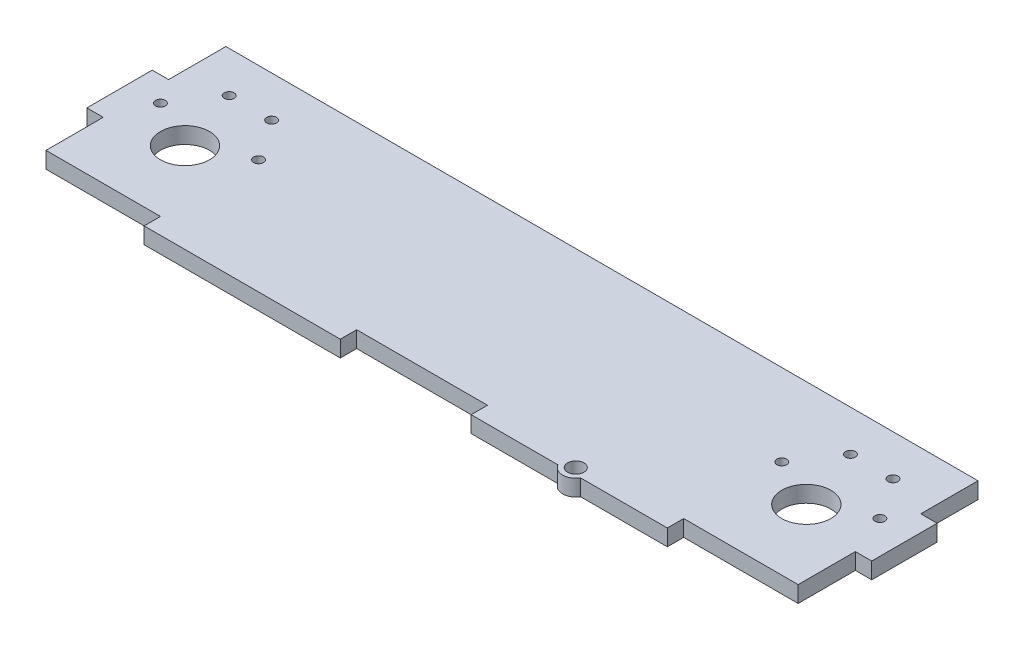
ISO-10303-21;
HEADER;
FILE_DESCRIPTION(('STEP AP214'),'2;1');
FILE_NAME('part.step','',(''),(''),'','','');
FILE_SCHEMA(('AUTOMOTIVE_DESIGN { 1 0 10303 214 1 1 1 1 }'));
ENDSEC;
DATA;
#1=APPLICATION_CONTEXT('core data for automotive mechanical design processes');
#2=APPLICATION_PROTOCOL_DEFINITION('international standard','automotive_design',2000,#1);
#3=PRODUCT_CONTEXT('',#1,'mechanical');
#4=PRODUCT('Part','Part','',(#3));
#5=PRODUCT_RELATED_PRODUCT_CATEGORY('part','',(#4));
#6=PRODUCT_DEFINITION_FORMATION('','',#4);
#7=PRODUCT_DEFINITION_CONTEXT('part definition',#1,'design');
#8=PRODUCT_DEFINITION('design','',#6,#7);
#9=PRODUCT_DEFINITION_SHAPE('','',#8);
#10=(LENGTH_UNIT() NAMED_UNIT(*) SI_UNIT(.MILLI.,.METRE.));
#11=(NAMED_UNIT(*) PLANE_ANGLE_UNIT() SI_UNIT($,.RADIAN.));
#12=(NAMED_UNIT(*) SI_UNIT($,.STERADIAN.) SOLID_ANGLE_UNIT());
#13=UNCERTAINTY_MEASURE_WITH_UNIT(LENGTH_MEASURE(1.E-05),#10,'distance_accuracy_value','');
#14=(GEOMETRIC_REPRESENTATION_CONTEXT(3) GLOBAL_UNCERTAINTY_ASSIGNED_CONTEXT((#13)) GLOBAL_UNIT_ASSIGNED_CONTEXT((#10,
#11,#12)) REPRESENTATION_CONTEXT('',''));
#15=CARTESIAN_POINT('',(0.,0.,0.));
#16=DIRECTION('',(0.,0.,1.));
#17=DIRECTION('',(1.,0.,0.));
#18=AXIS2_PLACEMENT_3D('',#15,#16,#17);
#19=CARTESIAN_POINT('',(54.7855342967924,5.,29.3914419247114));
#20=DIRECTION('',(0.,-1.,0.));
#21=DIRECTION('',(0.,0.,-1.));
#22=AXIS2_PLACEMENT_3D('',#19,#20,#21);
#23=CYLINDRICAL_SURFACE('',#22,4.00000000000001);
#24=CARTESIAN_POINT('',(54.7855342967924,0.,29.3914419247114));
#25=DIRECTION('',(0.,1.,0.));
#26=DIRECTION('',(0.,0.,1.));
#27=AXIS2_PLACEMENT_3D('',#24,#25,#26);
#28=CIRCLE('',#27,4.00000000000001);
#29=CARTESIAN_POINT('',(51.3214326816546,0.,31.3914419247114));
#30=VERTEX_POINT('',#29);
#31=CARTESIAN_POINT('',(58.2496359119302,0.,31.3914419247114));
#32=VERTEX_POINT('',#31);
#33=EDGE_CURVE('E252',#30,#32,#28,.T.);
#34=ORIENTED_EDGE('',*,*,#33,.T.);
#35=DIRECTION('',(0.,-1.,0.));
#36=VECTOR('',#35,1.);
#37=CARTESIAN_POINT('',(58.2496359119302,5.,31.3914419247114));
#38=LINE('',#37,#36);
#39=CARTESIAN_POINT('',(58.2496359119302,5.,31.3914419247114));
#40=VERTEX_POINT('',#39);
#41=EDGE_CURVE('E11',#40,#32,#38,.T.);
#42=ORIENTED_EDGE('',*,*,#41,.F.);
#43=CARTESIAN_POINT('',(54.7855342967924,5.,29.3914419247114));
#44=DIRECTION('',(0.,1.,0.));
#45=DIRECTION('',(0.,0.,1.));
#46=AXIS2_PLACEMENT_3D('',#43,#44,#45);
#47=CIRCLE('',#46,4.00000000000001);
#48=CARTESIAN_POINT('',(51.3214326816546,5.,31.3914419247114));
#49=VERTEX_POINT('',#48);
#50=EDGE_CURVE('E337',#49,#40,#47,.T.);
#51=ORIENTED_EDGE('',*,*,#50,.F.);
#52=DIRECTION('',(0.,-1.,0.));
#53=VECTOR('',#52,1.);
#54=CARTESIAN_POINT('',(51.3214326816546,5.,31.3914419247114));
#55=LINE('',#54,#53);
#56=EDGE_CURVE('E251',#49,#30,#55,.T.);
#57=ORIENTED_EDGE('',*,*,#56,.T.);
#58=EDGE_LOOP('',(#34,#42,#51,#57));
#59=FACE_BOUND('',#58,.T.);
#60=ADVANCED_FACE('F38',(#59),#23,.T.);
#61=CARTESIAN_POINT('',(0.,5.,31.3914419247114));
#62=DIRECTION('',(0.,0.,-1.));
#63=DIRECTION('',(-1.,0.,0.));
#64=AXIS2_PLACEMENT_3D('',#61,#62,#63);
#65=PLANE('',#64);
#66=DIRECTION('',(1.,0.,0.));
#67=VECTOR('',#66,1.);
#68=CARTESIAN_POINT('',(0.,0.,31.3914419247114));
#69=LINE('',#68,#67);
#70=CARTESIAN_POINT('',(84.7855342967924,0.,31.3914419247114));
#71=VERTEX_POINT('',#70);
#72=EDGE_CURVE('E255',#32,#71,#69,.T.);
#73=ORIENTED_EDGE('',*,*,#72,.T.);
#74=DIRECTION('',(0.,-1.,0.));
#75=VECTOR('',#74,1.);
#76=CARTESIAN_POINT('',(84.7855342967924,5.,31.3914419247114));
#77=LINE('',#76,#75);
#78=CARTESIAN_POINT('',(84.7855342967924,5.,31.3914419247114));
#79=VERTEX_POINT('',#78);
#80=EDGE_CURVE('E46',#79,#71,#77,.T.);
#81=ORIENTED_EDGE('',*,*,#80,.F.);
#82=DIRECTION('',(1.,0.,0.));
#83=VECTOR('',#82,1.);
#84=CARTESIAN_POINT('',(0.,5.,31.3914419247114));
#85=LINE('',#84,#83);
#86=EDGE_CURVE('E139',#40,#79,#85,.T.);
#87=ORIENTED_EDGE('',*,*,#86,.F.);
#88=ORIENTED_EDGE('',*,*,#41,.T.);
#89=EDGE_LOOP('',(#73,#81,#87,#88));
#90=FACE_BOUND('',#89,.T.);
#91=ADVANCED_FACE('F452',(#90),#65,.F.);
#92=CARTESIAN_POINT('',(84.7855342967925,5.,2.35327130828612E-13));
#93=DIRECTION('',(-1.,0.,0.));
#94=DIRECTION('',(0.,0.,1.));
#95=AXIS2_PLACEMENT_3D('',#92,#93,#94);
#96=PLANE('',#95);
#97=DIRECTION('',(0.,0.,-1.));
#98=VECTOR('',#97,1.);
#99=CARTESIAN_POINT('',(84.7855342967925,0.,2.35327130828612E-13));
#100=LINE('',#99,#98);
#101=CARTESIAN_POINT('',(84.7855342967924,0.,26.3914419247114));
#102=VERTEX_POINT('',#101);
#103=EDGE_CURVE('E257',#71,#102,#100,.T.);
#104=ORIENTED_EDGE('',*,*,#103,.T.);
#105=DIRECTION('',(0.,-1.,0.));
#106=VECTOR('',#105,1.);
#107=CARTESIAN_POINT('',(84.7855342967924,5.,26.3914419247114));
#108=LINE('',#107,#106);
#109=CARTESIAN_POINT('',(84.7855342967924,5.,26.3914419247114));
#110=VERTEX_POINT('',#109);
#111=EDGE_CURVE('E375',#110,#102,#108,.T.);
#112=ORIENTED_EDGE('',*,*,#111,.F.);
#113=DIRECTION('',(0.,0.,-1.));
#114=VECTOR('',#113,1.);
#115=CARTESIAN_POINT('',(84.7855342967925,5.,2.35327130828612E-13));
#116=LINE('',#115,#114);
#117=EDGE_CURVE('E383',#79,#110,#116,.T.);
#118=ORIENTED_EDGE('',*,*,#117,.F.);
#119=ORIENTED_EDGE('',*,*,#80,.T.);
#120=EDGE_LOOP('',(#104,#112,#118,#119));
#121=FACE_BOUND('',#120,.T.);
#122=ADVANCED_FACE('F381',(#121),#96,.F.);
#123=CARTESIAN_POINT('',(0.,5.,26.3914419247115));
#124=DIRECTION('',(0.,0.,-1.));
#125=DIRECTION('',(-1.,0.,0.));
#126=AXIS2_PLACEMENT_3D('',#123,#124,#125);
#127=PLANE('',#126);
#128=DIRECTION('',(1.,0.,0.));
#129=VECTOR('',#128,1.);
#130=CARTESIAN_POINT('',(0.,0.,26.3914419247115));
#131=LINE('',#130,#129);
#132=CARTESIAN_POINT('',(119.785534296792,0.,26.3914419247114));
#133=VERTEX_POINT('',#132);
#134=EDGE_CURVE('E259',#102,#133,#131,.T.);
#135=ORIENTED_EDGE('',*,*,#134,.T.);
#136=DIRECTION('',(0.,-1.,0.));
#137=VECTOR('',#136,1.);
#138=CARTESIAN_POINT('',(119.785534296792,5.,26.3914419247114));
#139=LINE('',#138,#137);
#140=CARTESIAN_POINT('',(119.785534296792,5.,26.3914419247114));
#141=VERTEX_POINT('',#140);
#142=EDGE_CURVE('E373',#141,#133,#139,.T.);
#143=ORIENTED_EDGE('',*,*,#142,.F.);
#144=DIRECTION('',(1.,0.,0.));
#145=VECTOR('',#144,1.);
#146=CARTESIAN_POINT('',(0.,5.,26.3914419247115));
#147=LINE('',#146,#145);
#148=EDGE_CURVE('E395',#110,#141,#147,.T.);
#149=ORIENTED_EDGE('',*,*,#148,.F.);
#150=ORIENTED_EDGE('',*,*,#111,.T.);
#151=EDGE_LOOP('',(#135,#143,#149,#150));
#152=FACE_BOUND('',#151,.T.);
#153=ADVANCED_FACE('F392',(#152),#127,.F.);
#154=CARTESIAN_POINT('',(119.785534296792,5.,0.));
#155=DIRECTION('',(1.,0.,0.));
#156=DIRECTION('',(0.,0.,-1.));
#157=AXIS2_PLACEMENT_3D('',#154,#155,#156);
#158=PLANE('',#157);
#159=DIRECTION('',(0.,0.,1.));
#160=VECTOR('',#159,1.);
#161=CARTESIAN_POINT('',(119.785534296792,0.,0.));
#162=LINE('',#161,#160);
#163=CARTESIAN_POINT('',(119.785534296792,0.,8.89144192471143));
#164=VERTEX_POINT('',#163);
#165=EDGE_CURVE('E262',#164,#133,#162,.T.);
#166=ORIENTED_EDGE('',*,*,#165,.F.);
#167=DIRECTION('',(0.,-1.,0.));
#168=VECTOR('',#167,1.);
#169=CARTESIAN_POINT('',(119.785534296792,5.,8.89144192471143));
#170=LINE('',#169,#168);
#171=CARTESIAN_POINT('',(119.785534296792,5.,8.89144192471143));
#172=VERTEX_POINT('',#171);
#173=EDGE_CURVE('E371',#172,#164,#170,.T.);
#174=ORIENTED_EDGE('',*,*,#173,.F.);
#175=DIRECTION('',(0.,0.,1.));
#176=VECTOR('',#175,1.);
#177=CARTESIAN_POINT('',(119.785534296792,5.,0.));
#178=LINE('',#177,#176);
#179=EDGE_CURVE('E397',#172,#141,#178,.T.);
#180=ORIENTED_EDGE('',*,*,#179,.T.);
#181=ORIENTED_EDGE('',*,*,#142,.T.);
#182=EDGE_LOOP('',(#166,#174,#180,#181));
#183=FACE_BOUND('',#182,.T.);
#184=ADVANCED_FACE('F482',(#183),#158,.T.);
#185=CARTESIAN_POINT('',(0.,5.,8.89144192471109));
#186=DIRECTION('',(0.,0.,1.));
#187=DIRECTION('',(1.,0.,0.));
#188=AXIS2_PLACEMENT_3D('',#185,#186,#187);
#189=PLANE('',#188);
#190=DIRECTION('',(-1.,0.,0.));
#191=VECTOR('',#190,1.);
#192=CARTESIAN_POINT('',(0.,0.,8.89144192471109));
#193=LINE('',#192,#191);
#194=CARTESIAN_POINT('',(124.785534296792,0.,8.89144192471144));
#195=VERTEX_POINT('',#194);
#196=EDGE_CURVE('E265',#195,#164,#193,.T.);
#197=ORIENTED_EDGE('',*,*,#196,.F.);
#198=DIRECTION('',(0.,-1.,0.));
#199=VECTOR('',#198,1.);
#200=CARTESIAN_POINT('',(124.785534296792,5.,8.89144192471144));
#201=LINE('',#200,#199);
#202=CARTESIAN_POINT('',(124.785534296792,5.,8.89144192471144));
#203=VERTEX_POINT('',#202);
#204=EDGE_CURVE('E369',#203,#195,#201,.T.);
#205=ORIENTED_EDGE('',*,*,#204,.F.);
#206=DIRECTION('',(-1.,0.,0.));
#207=VECTOR('',#206,1.);
#208=CARTESIAN_POINT('',(0.,5.,8.89144192471109));
#209=LINE('',#208,#207);
#210=EDGE_CURVE('E399',#203,#172,#209,.T.);
#211=ORIENTED_EDGE('',*,*,#210,.T.);
#212=ORIENTED_EDGE('',*,*,#173,.T.);
#213=EDGE_LOOP('',(#197,#205,#211,#212));
#214=FACE_BOUND('',#213,.T.);
#215=ADVANCED_FACE('F489',(#214),#189,.T.);
#216=CARTESIAN_POINT('',(124.785534296792,5.,0.));
#217=DIRECTION('',(1.,0.,0.));
#218=DIRECTION('',(0.,0.,-1.));
#219=AXIS2_PLACEMENT_3D('',#216,#217,#218);
#220=PLANE('',#219);
#221=DIRECTION('',(0.,0.,1.));
#222=VECTOR('',#221,1.);
#223=CARTESIAN_POINT('',(124.785534296792,0.,0.));
#224=LINE('',#223,#222);
#225=CARTESIAN_POINT('',(124.785534296792,0.,-11.1085580752886));
#226=VERTEX_POINT('',#225);
#227=EDGE_CURVE('E268',#226,#195,#224,.T.);
#228=ORIENTED_EDGE('',*,*,#227,.F.);
#229=DIRECTION('',(0.,-1.,0.));
#230=VECTOR('',#229,1.);
#231=CARTESIAN_POINT('',(124.785534296792,5.,-11.1085580752886));
#232=LINE('',#231,#230);
#233=CARTESIAN_POINT('',(124.785534296792,5.,-11.1085580752886));
#234=VERTEX_POINT('',#233);
#235=EDGE_CURVE('E367',#234,#226,#232,.T.);
#236=ORIENTED_EDGE('',*,*,#235,.F.);
#237=DIRECTION('',(0.,0.,1.));
#238=VECTOR('',#237,1.);
#239=CARTESIAN_POINT('',(124.785534296792,5.,0.));
#240=LINE('',#239,#238);
#241=EDGE_CURVE('E405',#234,#203,#240,.T.);
#242=ORIENTED_EDGE('',*,*,#241,.T.);
#243=ORIENTED_EDGE('',*,*,#204,.T.);
#244=EDGE_LOOP('',(#228,#236,#242,#243));
#245=FACE_BOUND('',#244,.T.);
#246=ADVANCED_FACE('F497',(#245),#220,.T.);
#247=CARTESIAN_POINT('',(0.,5.,-11.1085580752889));
#248=DIRECTION('',(0.,0.,-1.));
#249=DIRECTION('',(-1.,0.,0.));
#250=AXIS2_PLACEMENT_3D('',#247,#248,#249);
#251=PLANE('',#250);
#252=DIRECTION('',(1.,0.,0.));
#253=VECTOR('',#252,1.);
#254=CARTESIAN_POINT('',(0.,0.,-11.1085580752889));
#255=LINE('',#254,#253);
#256=CARTESIAN_POINT('',(119.785534296792,0.,-11.1085580752886));
#257=VERTEX_POINT('',#256);
#258=EDGE_CURVE('E271',#257,#226,#255,.T.);
#259=ORIENTED_EDGE('',*,*,#258,.F.);
#260=DIRECTION('',(0.,-1.,0.));
#261=VECTOR('',#260,1.);
#262=CARTESIAN_POINT('',(119.785534296792,5.,-11.1085580752886));
#263=LINE('',#262,#261);
#264=CARTESIAN_POINT('',(119.785534296792,5.,-11.1085580752886));
#265=VERTEX_POINT('',#264);
#266=EDGE_CURVE('E365',#265,#257,#263,.T.);
#267=ORIENTED_EDGE('',*,*,#266,.F.);
#268=DIRECTION('',(1.,0.,0.));
#269=VECTOR('',#268,1.);
#270=CARTESIAN_POINT('',(0.,5.,-11.1085580752889));
#271=LINE('',#270,#269);
#272=EDGE_CURVE('E408',#265,#234,#271,.T.);
#273=ORIENTED_EDGE('',*,*,#272,.T.);
#274=ORIENTED_EDGE('',*,*,#235,.T.);
#275=EDGE_LOOP('',(#259,#267,#273,#274));
#276=FACE_BOUND('',#275,.T.);
#277=ADVANCED_FACE('F505',(#276),#251,.T.);
#278=CARTESIAN_POINT('',(119.785534296792,5.,0.));
#279=DIRECTION('',(-1.,0.,0.));
#280=DIRECTION('',(0.,0.,1.));
#281=AXIS2_PLACEMENT_3D('',#278,#279,#280);
#282=PLANE('',#281);
#283=DIRECTION('',(0.,0.,-1.));
#284=VECTOR('',#283,1.);
#285=CARTESIAN_POINT('',(119.785534296792,0.,0.));
#286=LINE('',#285,#284);
#287=CARTESIAN_POINT('',(119.785534296792,0.,-28.6085580752886));
#288=VERTEX_POINT('',#287);
#289=EDGE_CURVE('E274',#257,#288,#286,.T.);
#290=ORIENTED_EDGE('',*,*,#289,.T.);
#291=DIRECTION('',(0.,-1.,0.));
#292=VECTOR('',#291,1.);
#293=CARTESIAN_POINT('',(119.785534296792,5.,-28.6085580752886));
#294=LINE('',#293,#292);
#295=CARTESIAN_POINT('',(119.785534296792,5.,-28.6085580752886));
#296=VERTEX_POINT('',#295);
#297=EDGE_CURVE('E363',#296,#288,#294,.T.);
#298=ORIENTED_EDGE('',*,*,#297,.F.);
#299=DIRECTION('',(0.,0.,-1.));
#300=VECTOR('',#299,1.);
#301=CARTESIAN_POINT('',(119.785534296792,5.,0.));
#302=LINE('',#301,#300);
#303=EDGE_CURVE('E411',#265,#296,#302,.T.);
#304=ORIENTED_EDGE('',*,*,#303,.F.);
#305=ORIENTED_EDGE('',*,*,#266,.T.);
#306=EDGE_LOOP('',(#290,#298,#304,#305));
#307=FACE_BOUND('',#306,.T.);
#308=ADVANCED_FACE('F513',(#307),#282,.F.);
#309=CARTESIAN_POINT('',(0.,5.,-28.6085580752886));
#310=DIRECTION('',(0.,0.,-1.));
#311=DIRECTION('',(-1.,0.,0.));
#312=AXIS2_PLACEMENT_3D('',#309,#310,#311);
#313=PLANE('',#312);
#314=DIRECTION('',(1.,0.,0.));
#315=VECTOR('',#314,1.);
#316=CARTESIAN_POINT('',(0.,0.,-28.6085580752886));
#317=LINE('',#316,#315);
#318=CARTESIAN_POINT('',(-110.214465703208,0.,-28.6085580752886));
#319=VERTEX_POINT('',#318);
#320=EDGE_CURVE('E277',#319,#288,#317,.T.);
#321=ORIENTED_EDGE('',*,*,#320,.F.);
#322=DIRECTION('',(0.,-1.,0.));
#323=VECTOR('',#322,1.);
#324=CARTESIAN_POINT('',(-110.214465703208,5.,-28.6085580752886));
#325=LINE('',#324,#323);
#326=CARTESIAN_POINT('',(-110.214465703208,5.,-28.6085580752886));
#327=VERTEX_POINT('',#326);
#328=EDGE_CURVE('E361',#327,#319,#325,.T.);
#329=ORIENTED_EDGE('',*,*,#328,.F.);
#330=DIRECTION('',(1.,0.,0.));
#331=VECTOR('',#330,1.);
#332=CARTESIAN_POINT('',(0.,5.,-28.6085580752886));
#333=LINE('',#332,#331);
#334=EDGE_CURVE('E413',#327,#296,#333,.T.);
#335=ORIENTED_EDGE('',*,*,#334,.T.);
#336=ORIENTED_EDGE('',*,*,#297,.T.);
#337=EDGE_LOOP('',(#321,#329,#335,#336));
#338=FACE_BOUND('',#337,.T.);
#339=ADVANCED_FACE('F521',(#338),#313,.T.);
#340=CARTESIAN_POINT('',(-110.214465703208,5.,0.));
#341=DIRECTION('',(-1.,0.,0.));
#342=DIRECTION('',(0.,0.,1.));
#343=AXIS2_PLACEMENT_3D('',#340,#341,#342);
#344=PLANE('',#343);
#345=DIRECTION('',(0.,0.,-1.));
#346=VECTOR('',#345,1.);
#347=CARTESIAN_POINT('',(-110.214465703208,0.,0.));
#348=LINE('',#347,#346);
#349=CARTESIAN_POINT('',(-110.214465703208,0.,-11.1085580752886));
#350=VERTEX_POINT('',#349);
#351=EDGE_CURVE('E280',#350,#319,#348,.T.);
#352=ORIENTED_EDGE('',*,*,#351,.F.);
#353=DIRECTION('',(0.,-1.,0.));
#354=VECTOR('',#353,1.);
#355=CARTESIAN_POINT('',(-110.214465703208,5.,-11.1085580752886));
#356=LINE('',#355,#354);
#357=CARTESIAN_POINT('',(-110.214465703208,5.,-11.1085580752886));
#358=VERTEX_POINT('',#357);
#359=EDGE_CURVE('E359',#358,#350,#356,.T.);
#360=ORIENTED_EDGE('',*,*,#359,.F.);
#361=DIRECTION('',(0.,0.,-1.));
#362=VECTOR('',#361,1.);
#363=CARTESIAN_POINT('',(-110.214465703208,5.,0.));
#364=LINE('',#363,#362);
#365=EDGE_CURVE('E416',#358,#327,#364,.T.);
#366=ORIENTED_EDGE('',*,*,#365,.T.);
#367=ORIENTED_EDGE('',*,*,#328,.T.);
#368=EDGE_LOOP('',(#352,#360,#366,#367));
#369=FACE_BOUND('',#368,.T.);
#370=ADVANCED_FACE('F529',(#369),#344,.T.);
#371=CARTESIAN_POINT('',(0.,5.,-11.1085580752886));
#372=DIRECTION('',(0.,0.,1.));
#373=DIRECTION('',(1.,0.,0.));
#374=AXIS2_PLACEMENT_3D('',#371,#372,#373);
#375=PLANE('',#374);
#376=DIRECTION('',(-1.,0.,0.));
#377=VECTOR('',#376,1.);
#378=CARTESIAN_POINT('',(0.,0.,-11.1085580752886));
#379=LINE('',#378,#377);
#380=CARTESIAN_POINT('',(-115.214465703208,0.,-11.1085580752886));
#381=VERTEX_POINT('',#380);
#382=EDGE_CURVE('E283',#350,#381,#379,.T.);
#383=ORIENTED_EDGE('',*,*,#382,.T.);
#384=DIRECTION('',(0.,-1.,0.));
#385=VECTOR('',#384,1.);
#386=CARTESIAN_POINT('',(-115.214465703208,5.,-11.1085580752886));
#387=LINE('',#386,#385);
#388=CARTESIAN_POINT('',(-115.214465703208,5.,-11.1085580752886));
#389=VERTEX_POINT('',#388);
#390=EDGE_CURVE('E356',#389,#381,#387,.T.);
#391=ORIENTED_EDGE('',*,*,#390,.F.);
#392=DIRECTION('',(-1.,0.,0.));
#393=VECTOR('',#392,1.);
#394=CARTESIAN_POINT('',(0.,5.,-11.1085580752886));
#395=LINE('',#394,#393);
#396=EDGE_CURVE('E419',#358,#389,#395,.T.);
#397=ORIENTED_EDGE('',*,*,#396,.F.);
#398=ORIENTED_EDGE('',*,*,#359,.T.);
#399=EDGE_LOOP('',(#383,#391,#397,#398));
#400=FACE_BOUND('',#399,.T.);
#401=ADVANCED_FACE('F537',(#400),#375,.F.);
#402=CARTESIAN_POINT('',(-115.214465703208,5.,0.));
#403=DIRECTION('',(1.,0.,0.));
#404=DIRECTION('',(0.,0.,-1.));
#405=AXIS2_PLACEMENT_3D('',#402,#403,#404);
#406=PLANE('',#405);
#407=DIRECTION('',(0.,0.,1.));
#408=VECTOR('',#407,1.);
#409=CARTESIAN_POINT('',(-115.214465703208,0.,0.));
#410=LINE('',#409,#408);
#411=CARTESIAN_POINT('',(-115.214465703208,0.,8.89144192471144));
#412=VERTEX_POINT('',#411);
#413=EDGE_CURVE('E285',#381,#412,#410,.T.);
#414=ORIENTED_EDGE('',*,*,#413,.T.);
#415=DIRECTION('',(0.,-1.,0.));
#416=VECTOR('',#415,1.);
#417=CARTESIAN_POINT('',(-115.214465703208,5.,8.89144192471144));
#418=LINE('',#417,#416);
#419=CARTESIAN_POINT('',(-115.214465703208,5.,8.89144192471144));
#420=VERTEX_POINT('',#419);
#421=EDGE_CURVE('E353',#420,#412,#418,.T.);
#422=ORIENTED_EDGE('',*,*,#421,.F.);
#423=DIRECTION('',(0.,0.,1.));
#424=VECTOR('',#423,1.);
#425=CARTESIAN_POINT('',(-115.214465703208,5.,0.));
#426=LINE('',#425,#424);
#427=EDGE_CURVE('E421',#389,#420,#426,.T.);
#428=ORIENTED_EDGE('',*,*,#427,.F.);
#429=ORIENTED_EDGE('',*,*,#390,.T.);
#430=EDGE_LOOP('',(#414,#422,#428,#429));
#431=FACE_BOUND('',#430,.T.);
#432=ADVANCED_FACE('F545',(#431),#406,.F.);
#433=CARTESIAN_POINT('',(0.,5.,8.89144192471148));
#434=DIRECTION('',(0.,0.,-1.));
#435=DIRECTION('',(-1.,0.,0.));
#436=AXIS2_PLACEMENT_3D('',#433,#434,#435);
#437=PLANE('',#436);
#438=DIRECTION('',(1.,0.,0.));
#439=VECTOR('',#438,1.);
#440=CARTESIAN_POINT('',(0.,0.,8.89144192471148));
#441=LINE('',#440,#439);
#442=CARTESIAN_POINT('',(-110.214465703208,0.,8.89144192471144));
#443=VERTEX_POINT('',#442);
#444=EDGE_CURVE('E287',#412,#443,#441,.T.);
#445=ORIENTED_EDGE('',*,*,#444,.T.);
#446=DIRECTION('',(0.,-1.,0.));
#447=VECTOR('',#446,1.);
#448=CARTESIAN_POINT('',(-110.214465703208,5.,8.89144192471144));
#449=LINE('',#448,#447);
#450=CARTESIAN_POINT('',(-110.214465703208,5.,8.89144192471144));
#451=VERTEX_POINT('',#450);
#452=EDGE_CURVE('E350',#451,#443,#449,.T.);
#453=ORIENTED_EDGE('',*,*,#452,.F.);
#454=DIRECTION('',(1.,0.,0.));
#455=VECTOR('',#454,1.);
#456=CARTESIAN_POINT('',(0.,5.,8.89144192471148));
#457=LINE('',#456,#455);
#458=EDGE_CURVE('E423',#420,#451,#457,.T.);
#459=ORIENTED_EDGE('',*,*,#458,.F.);
#460=ORIENTED_EDGE('',*,*,#421,.T.);
#461=EDGE_LOOP('',(#445,#453,#459,#460));
#462=FACE_BOUND('',#461,.T.);
#463=ADVANCED_FACE('F553',(#462),#437,.F.);
#464=CARTESIAN_POINT('',(-110.214465703208,5.,0.));
#465=DIRECTION('',(1.,0.,0.));
#466=DIRECTION('',(0.,0.,-1.));
#467=AXIS2_PLACEMENT_3D('',#464,#465,#466);
#468=PLANE('',#467);
#469=DIRECTION('',(0.,0.,1.));
#470=VECTOR('',#469,1.);
#471=CARTESIAN_POINT('',(-110.214465703208,0.,0.));
#472=LINE('',#471,#470);
#473=CARTESIAN_POINT('',(-110.214465703208,0.,26.3914419247114));
#474=VERTEX_POINT('',#473);
#475=EDGE_CURVE('E289',#443,#474,#472,.T.);
#476=ORIENTED_EDGE('',*,*,#475,.T.);
#477=DIRECTION('',(0.,-1.,0.));
#478=VECTOR('',#477,1.);
#479=CARTESIAN_POINT('',(-110.214465703208,5.,26.3914419247114));
#480=LINE('',#479,#478);
#481=CARTESIAN_POINT('',(-110.214465703208,5.,26.3914419247114));
#482=VERTEX_POINT('',#481);
#483=EDGE_CURVE('E348',#482,#474,#480,.T.);
#484=ORIENTED_EDGE('',*,*,#483,.F.);
#485=DIRECTION('',(0.,0.,1.));
#486=VECTOR('',#485,1.);
#487=CARTESIAN_POINT('',(-110.214465703208,5.,0.));
#488=LINE('',#487,#486);
#489=EDGE_CURVE('E425',#451,#482,#488,.T.);
#490=ORIENTED_EDGE('',*,*,#489,.F.);
#491=ORIENTED_EDGE('',*,*,#452,.T.);
#492=EDGE_LOOP('',(#476,#484,#490,#491));
#493=FACE_BOUND('',#492,.T.);
#494=ADVANCED_FACE('F561',(#493),#468,.F.);
#495=CARTESIAN_POINT('',(0.,5.,26.3914419247114));
#496=DIRECTION('',(0.,0.,1.));
#497=DIRECTION('',(1.,0.,0.));
#498=AXIS2_PLACEMENT_3D('',#495,#496,#497);
#499=PLANE('',#498);
#500=DIRECTION('',(-1.,0.,0.));
#501=VECTOR('',#500,1.);
#502=CARTESIAN_POINT('',(0.,0.,26.3914419247114));
#503=LINE('',#502,#501);
#504=CARTESIAN_POINT('',(-75.2144657032076,0.,26.3914419247114));
#505=VERTEX_POINT('',#504);
#506=EDGE_CURVE('E292',#505,#474,#503,.T.);
#507=ORIENTED_EDGE('',*,*,#506,.F.);
#508=DIRECTION('',(0.,-1.,0.));
#509=VECTOR('',#508,1.);
#510=CARTESIAN_POINT('',(-75.2144657032076,5.,26.3914419247114));
#511=LINE('',#510,#509);
#512=CARTESIAN_POINT('',(-75.2144657032076,5.,26.3914419247114));
#513=VERTEX_POINT('',#512);
#514=EDGE_CURVE('E346',#513,#505,#511,.T.);
#515=ORIENTED_EDGE('',*,*,#514,.F.);
#516=DIRECTION('',(-1.,0.,0.));
#517=VECTOR('',#516,1.);
#518=CARTESIAN_POINT('',(0.,5.,26.3914419247114));
#519=LINE('',#518,#517);
#520=EDGE_CURVE('E427',#513,#482,#519,.T.);
#521=ORIENTED_EDGE('',*,*,#520,.T.);
#522=ORIENTED_EDGE('',*,*,#483,.T.);
#523=EDGE_LOOP('',(#507,#515,#521,#522));
#524=FACE_BOUND('',#523,.T.);
#525=ADVANCED_FACE('F569',(#524),#499,.T.);
#526=CARTESIAN_POINT('',(-75.2144657032075,5.,-2.0876207902145E-13));
#527=DIRECTION('',(-1.,0.,0.));
#528=DIRECTION('',(0.,0.,1.));
#529=AXIS2_PLACEMENT_3D('',#526,#527,#528);
#530=PLANE('',#529);
#531=DIRECTION('',(0.,0.,-1.));
#532=VECTOR('',#531,1.);
#533=CARTESIAN_POINT('',(-75.2144657032075,0.,-2.0876207902145E-13));
#534=LINE('',#533,#532);
#535=CARTESIAN_POINT('',(-75.2144657032076,0.,31.3914419247114));
#536=VERTEX_POINT('',#535);
#537=EDGE_CURVE('E295',#536,#505,#534,.T.);
#538=ORIENTED_EDGE('',*,*,#537,.F.);
#539=DIRECTION('',(0.,-1.,0.));
#540=VECTOR('',#539,1.);
#541=CARTESIAN_POINT('',(-75.2144657032076,5.,31.3914419247114));
#542=LINE('',#541,#540);
#543=CARTESIAN_POINT('',(-75.2144657032076,5.,31.3914419247114));
#544=VERTEX_POINT('',#543);
#545=EDGE_CURVE('E344',#544,#536,#542,.T.);
#546=ORIENTED_EDGE('',*,*,#545,.F.);
#547=DIRECTION('',(0.,0.,-1.));
#548=VECTOR('',#547,1.);
#549=CARTESIAN_POINT('',(-75.2144657032075,5.,-2.0876207902145E-13));
#550=LINE('',#549,#548);
#551=EDGE_CURVE('E430',#544,#513,#550,.T.);
#552=ORIENTED_EDGE('',*,*,#551,.T.);
#553=ORIENTED_EDGE('',*,*,#514,.T.);
#554=EDGE_LOOP('',(#538,#546,#552,#553));
#555=FACE_BOUND('',#554,.T.);
#556=ADVANCED_FACE('F577',(#555),#530,.T.);
#557=CARTESIAN_POINT('',(0.,5.,31.3914419247114));
#558=DIRECTION('',(0.,0.,-1.));
#559=DIRECTION('',(-1.,0.,0.));
#560=AXIS2_PLACEMENT_3D('',#557,#558,#559);
#561=PLANE('',#560);
#562=DIRECTION('',(1.,0.,0.));
#563=VECTOR('',#562,1.);
#564=CARTESIAN_POINT('',(0.,0.,31.3914419247114));
#565=LINE('',#564,#563);
#566=CARTESIAN_POINT('',(-15.2144657032076,0.,31.3914419247114));
#567=VERTEX_POINT('',#566);
#568=EDGE_CURVE('E298',#536,#567,#565,.T.);
#569=ORIENTED_EDGE('',*,*,#568,.T.);
#570=DIRECTION('',(0.,-1.,0.));
#571=VECTOR('',#570,1.);
#572=CARTESIAN_POINT('',(-15.2144657032076,5.,31.3914419247114));
#573=LINE('',#572,#571);
#574=CARTESIAN_POINT('',(-15.2144657032076,5.,31.3914419247114));
#575=VERTEX_POINT('',#574);
#576=EDGE_CURVE('E341',#575,#567,#573,.T.);
#577=ORIENTED_EDGE('',*,*,#576,.F.);
#578=DIRECTION('',(1.,0.,0.));
#579=VECTOR('',#578,1.);
#580=CARTESIAN_POINT('',(0.,5.,31.3914419247114));
#581=LINE('',#580,#579);
#582=EDGE_CURVE('E433',#544,#575,#581,.T.);
#583=ORIENTED_EDGE('',*,*,#582,.F.);
#584=ORIENTED_EDGE('',*,*,#545,.T.);
#585=EDGE_LOOP('',(#569,#577,#583,#584));
#586=FACE_BOUND('',#585,.T.);
#587=ADVANCED_FACE('F439',(#586),#561,.F.);
#588=CARTESIAN_POINT('',(-15.2144657032076,5.,0.));
#589=DIRECTION('',(-1.,0.,0.));
#590=DIRECTION('',(0.,0.,1.));
#591=AXIS2_PLACEMENT_3D('',#588,#589,#590);
#592=PLANE('',#591);
#593=DIRECTION('',(0.,0.,-1.));
#594=VECTOR('',#593,1.);
#595=CARTESIAN_POINT('',(-15.2144657032076,0.,0.));
#596=LINE('',#595,#594);
#597=CARTESIAN_POINT('',(-15.2144657032076,0.,26.3914419247114));
#598=VERTEX_POINT('',#597);
#599=EDGE_CURVE('E300',#567,#598,#596,.T.);
#600=ORIENTED_EDGE('',*,*,#599,.T.);
#601=DIRECTION('',(0.,-1.,0.));
#602=VECTOR('',#601,1.);
#603=CARTESIAN_POINT('',(-15.2144657032076,5.,26.3914419247114));
#604=LINE('',#603,#602);
#605=CARTESIAN_POINT('',(-15.2144657032076,5.,26.3914419247114));
#606=VERTEX_POINT('',#605);
#607=EDGE_CURVE('E210',#606,#598,#604,.T.);
#608=ORIENTED_EDGE('',*,*,#607,.F.);
#609=DIRECTION('',(0.,0.,-1.));
#610=VECTOR('',#609,1.);
#611=CARTESIAN_POINT('',(-15.2144657032076,5.,0.));
#612=LINE('',#611,#610);
#613=EDGE_CURVE('E201',#575,#606,#612,.T.);
#614=ORIENTED_EDGE('',*,*,#613,.F.);
#615=ORIENTED_EDGE('',*,*,#576,.T.);
#616=EDGE_LOOP('',(#600,#608,#614,#615));
#617=FACE_BOUND('',#616,.T.);
#618=ADVANCED_FACE('F443',(#617),#592,.F.);
#619=CARTESIAN_POINT('',(0.,5.,26.3914419247114));
#620=DIRECTION('',(0.,0.,-1.));
#621=DIRECTION('',(-1.,0.,0.));
#622=AXIS2_PLACEMENT_3D('',#619,#620,#621);
#623=PLANE('',#622);
#624=DIRECTION('',(1.,0.,0.));
#625=VECTOR('',#624,1.);
#626=CARTESIAN_POINT('',(0.,0.,26.3914419247114));
#627=LINE('',#626,#625);
#628=CARTESIAN_POINT('',(24.7855342967924,0.,26.3914419247114));
#629=VERTEX_POINT('',#628);
#630=EDGE_CURVE('E209',#598,#629,#627,.T.);
#631=ORIENTED_EDGE('',*,*,#630,.T.);
#632=DIRECTION('',(0.,-1.,0.));
#633=VECTOR('',#632,1.);
#634=CARTESIAN_POINT('',(24.7855342967924,5.,26.3914419247114));
#635=LINE('',#634,#633);
#636=CARTESIAN_POINT('',(24.7855342967924,5.,26.3914419247114));
#637=VERTEX_POINT('',#636);
#638=EDGE_CURVE('E206',#637,#629,#635,.T.);
#639=ORIENTED_EDGE('',*,*,#638,.F.);
#640=DIRECTION('',(1.,0.,0.));
#641=VECTOR('',#640,1.);
#642=CARTESIAN_POINT('',(0.,5.,26.3914419247114));
#643=LINE('',#642,#641);
#644=EDGE_CURVE('E194',#606,#637,#643,.T.);
#645=ORIENTED_EDGE('',*,*,#644,.F.);
#646=ORIENTED_EDGE('',*,*,#607,.T.);
#647=EDGE_LOOP('',(#631,#639,#645,#646));
#648=FACE_BOUND('',#647,.T.);
#649=ADVANCED_FACE('F207',(#648),#623,.F.);
#650=CARTESIAN_POINT('',(24.7855342967925,5.,0.));
#651=DIRECTION('',(1.,0.,0.));
#652=DIRECTION('',(0.,0.,-1.));
#653=AXIS2_PLACEMENT_3D('',#650,#651,#652);
#654=PLANE('',#653);
#655=DIRECTION('',(0.,0.,1.));
#656=VECTOR('',#655,1.);
#657=CARTESIAN_POINT('',(24.7855342967925,0.,0.));
#658=LINE('',#657,#656);
#659=CARTESIAN_POINT('',(24.7855342967924,0.,31.3914419247114));
#660=VERTEX_POINT('',#659);
#661=EDGE_CURVE('E125',#629,#660,#658,.T.);
#662=ORIENTED_EDGE('',*,*,#661,.T.);
#663=DIRECTION('',(0.,-1.,0.));
#664=VECTOR('',#663,1.);
#665=CARTESIAN_POINT('',(24.7855342967924,5.,31.3914419247114));
#666=LINE('',#665,#664);
#667=CARTESIAN_POINT('',(24.7855342967924,5.,31.3914419247114));
#668=VERTEX_POINT('',#667);
#669=EDGE_CURVE('E211',#668,#660,#666,.T.);
#670=ORIENTED_EDGE('',*,*,#669,.F.);
#671=DIRECTION('',(0.,0.,1.));
#672=VECTOR('',#671,1.);
#673=CARTESIAN_POINT('',(24.7855342967925,5.,0.));
#674=LINE('',#673,#672);
#675=EDGE_CURVE('E199',#637,#668,#674,.T.);
#676=ORIENTED_EDGE('',*,*,#675,.F.);
#677=ORIENTED_EDGE('',*,*,#638,.T.);
#678=EDGE_LOOP('',(#662,#670,#676,#677));
#679=FACE_BOUND('',#678,.T.);
#680=ADVANCED_FACE('F213',(#679),#654,.F.);
#681=CARTESIAN_POINT('',(-75.2144657032076,5.,-3.60855807528855));
#682=DIRECTION('',(0.,-1.,0.));
#683=DIRECTION('',(0.,0.,-1.));
#684=AXIS2_PLACEMENT_3D('',#681,#682,#683);
#685=CYLINDRICAL_SURFACE('',#684,1.5);
#686=CARTESIAN_POINT('',(-75.2144657032076,5.,-3.60855807528855));
#687=DIRECTION('',(0.,1.,0.));
#688=DIRECTION('',(0.,0.,1.));
#689=AXIS2_PLACEMENT_3D('',#686,#687,#688);
#690=CIRCLE('',#689,1.5);
#691=CARTESIAN_POINT('',(-75.2144657032076,5.,-2.10855807528855));
#692=VERTEX_POINT('',#691);
#693=EDGE_CURVE('E245',#692,#692,#690,.T.);
#694=ORIENTED_EDGE('',*,*,#693,.T.);
#695=EDGE_LOOP('',(#694));
#696=FACE_BOUND('',#695,.T.);
#697=CARTESIAN_POINT('',(-75.2144657032076,0.,-3.60855807528855));
#698=DIRECTION('',(0.,1.,0.));
#699=DIRECTION('',(0.,0.,1.));
#700=AXIS2_PLACEMENT_3D('',#697,#698,#699);
#701=CIRCLE('',#700,1.5);
#702=CARTESIAN_POINT('',(-75.2144657032076,0.,-2.10855807528855));
#703=VERTEX_POINT('',#702);
#704=EDGE_CURVE('E331',#703,#703,#701,.T.);
#705=ORIENTED_EDGE('',*,*,#704,.F.);
#706=EDGE_LOOP('',(#705));
#707=FACE_BOUND('',#706,.T.);
#708=ADVANCED_FACE('F610',(#696,#707),#685,.F.);
#709=CARTESIAN_POINT('',(-83.7144657032076,5.,-16.1085580752886));
#710=DIRECTION('',(0.,-1.,0.));
#711=DIRECTION('',(0.,0.,-1.));
#712=AXIS2_PLACEMENT_3D('',#709,#710,#711);
#713=CYLINDRICAL_SURFACE('',#712,1.5);
#714=CARTESIAN_POINT('',(-83.7144657032076,5.,-16.1085580752886));
#715=DIRECTION('',(0.,1.,0.));
#716=DIRECTION('',(0.,0.,1.));
#717=AXIS2_PLACEMENT_3D('',#714,#715,#716);
#718=CIRCLE('',#717,1.5);
#719=CARTESIAN_POINT('',(-83.7144657032076,5.,-14.6085580752886));
#720=VERTEX_POINT('',#719);
#721=EDGE_CURVE('E242',#720,#720,#718,.T.);
#722=ORIENTED_EDGE('',*,*,#721,.T.);
#723=EDGE_LOOP('',(#722));
#724=FACE_BOUND('',#723,.T.);
#725=CARTESIAN_POINT('',(-83.7144657032076,0.,-16.1085580752886));
#726=DIRECTION('',(0.,1.,0.));
#727=DIRECTION('',(0.,0.,1.));
#728=AXIS2_PLACEMENT_3D('',#725,#726,#727);
#729=CIRCLE('',#728,1.5);
#730=CARTESIAN_POINT('',(-83.7144657032076,0.,-14.6085580752886));
#731=VERTEX_POINT('',#730);
#732=EDGE_CURVE('E328',#731,#731,#729,.T.);
#733=ORIENTED_EDGE('',*,*,#732,.F.);
#734=EDGE_LOOP('',(#733));
#735=FACE_BOUND('',#734,.T.);
#736=ADVANCED_FACE('F616',(#724,#735),#713,.F.);
#737=CARTESIAN_POINT('',(-105.214465703208,5.,-3.60855807528855));
#738=DIRECTION('',(0.,-1.,0.));
#739=DIRECTION('',(0.,0.,-1.));
#740=AXIS2_PLACEMENT_3D('',#737,#738,#739);
#741=CYLINDRICAL_SURFACE('',#740,1.5);
#742=CARTESIAN_POINT('',(-105.214465703208,5.,-3.60855807528855));
#743=DIRECTION('',(0.,1.,0.));
#744=DIRECTION('',(0.,0.,1.));
#745=AXIS2_PLACEMENT_3D('',#742,#743,#744);
#746=CIRCLE('',#745,1.5);
#747=CARTESIAN_POINT('',(-105.214465703208,5.,-2.10855807528855));
#748=VERTEX_POINT('',#747);
#749=EDGE_CURVE('E239',#748,#748,#746,.F.);
#750=ORIENTED_EDGE('',*,*,#749,.F.);
#751=EDGE_LOOP('',(#750));
#752=FACE_BOUND('',#751,.T.);
#753=CARTESIAN_POINT('',(-105.214465703208,0.,-3.60855807528855));
#754=DIRECTION('',(0.,1.,0.));
#755=DIRECTION('',(0.,0.,1.));
#756=AXIS2_PLACEMENT_3D('',#753,#754,#755);
#757=CIRCLE('',#756,1.5);
#758=CARTESIAN_POINT('',(-105.214465703208,0.,-2.10855807528855));
#759=VERTEX_POINT('',#758);
#760=EDGE_CURVE('E325',#759,#759,#757,.F.);
#761=ORIENTED_EDGE('',*,*,#760,.T.);
#762=EDGE_LOOP('',(#761));
#763=FACE_BOUND('',#762,.T.);
#764=ADVANCED_FACE('F624',(#752,#763),#741,.F.);
#765=CARTESIAN_POINT('',(54.7855342967924,5.,29.3914419247114));
#766=DIRECTION('',(0.,-1.,0.));
#767=DIRECTION('',(0.,0.,-1.));
#768=AXIS2_PLACEMENT_3D('',#765,#766,#767);
#769=CYLINDRICAL_SURFACE('',#768,2.5);
#770=CARTESIAN_POINT('',(54.7855342967924,5.,29.3914419247114));
#771=DIRECTION('',(0.,1.,0.));
#772=DIRECTION('',(0.,0.,1.));
#773=AXIS2_PLACEMENT_3D('',#770,#771,#772);
#774=CIRCLE('',#773,2.5);
#775=CARTESIAN_POINT('',(54.7855342967924,5.,31.8914419247114));
#776=VERTEX_POINT('',#775);
#777=EDGE_CURVE('E236',#776,#776,#774,.T.);
#778=ORIENTED_EDGE('',*,*,#777,.T.);
#779=EDGE_LOOP('',(#778));
#780=FACE_BOUND('',#779,.T.);
#781=CARTESIAN_POINT('',(54.7855342967924,0.,29.3914419247114));
#782=DIRECTION('',(0.,1.,0.));
#783=DIRECTION('',(0.,0.,1.));
#784=AXIS2_PLACEMENT_3D('',#781,#782,#783);
#785=CIRCLE('',#784,2.5);
#786=CARTESIAN_POINT('',(54.7855342967924,0.,31.8914419247114));
#787=VERTEX_POINT('',#786);
#788=EDGE_CURVE('E322',#787,#787,#785,.T.);
#789=ORIENTED_EDGE('',*,*,#788,.F.);
#790=EDGE_LOOP('',(#789));
#791=FACE_BOUND('',#790,.T.);
#792=ADVANCED_FACE('F632',(#780,#791),#769,.F.);
#793=CARTESIAN_POINT('',(93.2855342967924,5.,-16.1085580752886));
#794=DIRECTION('',(0.,-1.,0.));
#795=DIRECTION('',(0.,0.,-1.));
#796=AXIS2_PLACEMENT_3D('',#793,#794,#795);
#797=CYLINDRICAL_SURFACE('',#796,1.5);
#798=CARTESIAN_POINT('',(93.2855342967924,5.,-16.1085580752886));
#799=DIRECTION('',(0.,1.,0.));
#800=DIRECTION('',(0.,0.,1.));
#801=AXIS2_PLACEMENT_3D('',#798,#799,#800);
#802=CIRCLE('',#801,1.5);
#803=CARTESIAN_POINT('',(93.2855342967924,5.,-14.6085580752886));
#804=VERTEX_POINT('',#803);
#805=EDGE_CURVE('E233',#804,#804,#802,.F.);
#806=ORIENTED_EDGE('',*,*,#805,.F.);
#807=EDGE_LOOP('',(#806));
#808=FACE_BOUND('',#807,.T.);
#809=CARTESIAN_POINT('',(93.2855342967924,0.,-16.1085580752886));
#810=DIRECTION('',(0.,1.,0.));
#811=DIRECTION('',(0.,0.,1.));
#812=AXIS2_PLACEMENT_3D('',#809,#810,#811);
#813=CIRCLE('',#812,1.5);
#814=CARTESIAN_POINT('',(93.2855342967924,0.,-14.6085580752886));
#815=VERTEX_POINT('',#814);
#816=EDGE_CURVE('E319',#815,#815,#813,.F.);
#817=ORIENTED_EDGE('',*,*,#816,.T.);
#818=EDGE_LOOP('',(#817));
#819=FACE_BOUND('',#818,.T.);
#820=ADVANCED_FACE('F640',(#808,#819),#797,.F.);
#821=CARTESIAN_POINT('',(106.285534296792,5.,-16.1085580752886));
#822=DIRECTION('',(0.,-1.,0.));
#823=DIRECTION('',(0.,0.,-1.));
#824=AXIS2_PLACEMENT_3D('',#821,#822,#823);
#825=CYLINDRICAL_SURFACE('',#824,1.5);
#826=CARTESIAN_POINT('',(106.285534296792,5.,-16.1085580752886));
#827=DIRECTION('',(0.,1.,0.));
#828=DIRECTION('',(0.,0.,1.));
#829=AXIS2_PLACEMENT_3D('',#826,#827,#828);
#830=CIRCLE('',#829,1.5);
#831=CARTESIAN_POINT('',(106.285534296792,5.,-14.6085580752886));
#832=VERTEX_POINT('',#831);
#833=EDGE_CURVE('E230',#832,#832,#830,.T.);
#834=ORIENTED_EDGE('',*,*,#833,.T.);
#835=EDGE_LOOP('',(#834));
#836=FACE_BOUND('',#835,.T.);
#837=CARTESIAN_POINT('',(106.285534296792,0.,-16.1085580752886));
#838=DIRECTION('',(0.,1.,0.));
#839=DIRECTION('',(0.,0.,1.));
#840=AXIS2_PLACEMENT_3D('',#837,#838,#839);
#841=CIRCLE('',#840,1.5);
#842=CARTESIAN_POINT('',(106.285534296792,0.,-14.6085580752886));
#843=VERTEX_POINT('',#842);
#844=EDGE_CURVE('E316',#843,#843,#841,.T.);
#845=ORIENTED_EDGE('',*,*,#844,.F.);
#846=EDGE_LOOP('',(#845));
#847=FACE_BOUND('',#846,.T.);
#848=ADVANCED_FACE('F648',(#836,#847),#825,.F.);
#849=CARTESIAN_POINT('',(114.785534296792,5.,-3.60855807528856));
#850=DIRECTION('',(0.,-1.,0.));
#851=DIRECTION('',(0.,0.,-1.));
#852=AXIS2_PLACEMENT_3D('',#849,#850,#851);
#853=CYLINDRICAL_SURFACE('',#852,1.5);
#854=CARTESIAN_POINT('',(114.785534296792,5.,-3.60855807528856));
#855=DIRECTION('',(0.,1.,0.));
#856=DIRECTION('',(0.,0.,1.));
#857=AXIS2_PLACEMENT_3D('',#854,#855,#856);
#858=CIRCLE('',#857,1.5);
#859=CARTESIAN_POINT('',(114.785534296792,5.,-2.10855807528856));
#860=VERTEX_POINT('',#859);
#861=EDGE_CURVE('E227',#860,#860,#858,.T.);
#862=ORIENTED_EDGE('',*,*,#861,.T.);
#863=EDGE_LOOP('',(#862));
#864=FACE_BOUND('',#863,.T.);
#865=CARTESIAN_POINT('',(114.785534296792,0.,-3.60855807528856));
#866=DIRECTION('',(0.,1.,0.));
#867=DIRECTION('',(0.,0.,1.));
#868=AXIS2_PLACEMENT_3D('',#865,#866,#867);
#869=CIRCLE('',#868,1.5);
#870=CARTESIAN_POINT('',(114.785534296792,0.,-2.10855807528856));
#871=VERTEX_POINT('',#870);
#872=EDGE_CURVE('E313',#871,#871,#869,.T.);
#873=ORIENTED_EDGE('',*,*,#872,.F.);
#874=EDGE_LOOP('',(#873));
#875=FACE_BOUND('',#874,.T.);
#876=ADVANCED_FACE('F656',(#864,#875),#853,.F.);
#877=CARTESIAN_POINT('',(99.7855342967924,5.,3.89144192471144));
#878=DIRECTION('',(0.,-1.,0.));
#879=DIRECTION('',(0.,0.,-1.));
#880=AXIS2_PLACEMENT_3D('',#877,#878,#879);
#881=CYLINDRICAL_SURFACE('',#880,7.50000000000001);
#882=CARTESIAN_POINT('',(99.7855342967924,5.,3.89144192471144));
#883=DIRECTION('',(0.,1.,0.));
#884=DIRECTION('',(0.,0.,1.));
#885=AXIS2_PLACEMENT_3D('',#882,#883,#884);
#886=CIRCLE('',#885,7.50000000000001);
#887=CARTESIAN_POINT('',(99.7855342967924,5.,11.3914419247115));
#888=VERTEX_POINT('',#887);
#889=EDGE_CURVE('E224',#888,#888,#886,.T.);
#890=ORIENTED_EDGE('',*,*,#889,.T.);
#891=EDGE_LOOP('',(#890));
#892=FACE_BOUND('',#891,.T.);
#893=CARTESIAN_POINT('',(99.7855342967924,0.,3.89144192471144));
#894=DIRECTION('',(0.,1.,0.));
#895=DIRECTION('',(0.,0.,1.));
#896=AXIS2_PLACEMENT_3D('',#893,#894,#895);
#897=CIRCLE('',#896,7.50000000000001);
#898=CARTESIAN_POINT('',(99.7855342967924,0.,11.3914419247115));
#899=VERTEX_POINT('',#898);
#900=EDGE_CURVE('E310',#899,#899,#897,.T.);
#901=ORIENTED_EDGE('',*,*,#900,.F.);
#902=EDGE_LOOP('',(#901));
#903=FACE_BOUND('',#902,.T.);
#904=ADVANCED_FACE('F664',(#892,#903),#881,.F.);
#905=CARTESIAN_POINT('',(84.7855342967924,5.,-3.60855807528856));
#906=DIRECTION('',(0.,-1.,0.));
#907=DIRECTION('',(0.,0.,-1.));
#908=AXIS2_PLACEMENT_3D('',#905,#906,#907);
#909=CYLINDRICAL_SURFACE('',#908,1.5);
#910=CARTESIAN_POINT('',(84.7855342967924,5.,-3.60855807528856));
#911=DIRECTION('',(0.,1.,0.));
#912=DIRECTION('',(0.,0.,1.));
#913=AXIS2_PLACEMENT_3D('',#910,#911,#912);
#914=CIRCLE('',#913,1.5);
#915=CARTESIAN_POINT('',(84.7855342967924,5.,-2.10855807528856));
#916=VERTEX_POINT('',#915);
#917=EDGE_CURVE('E221',#916,#916,#914,.F.);
#918=ORIENTED_EDGE('',*,*,#917,.F.);
#919=EDGE_LOOP('',(#918));
#920=FACE_BOUND('',#919,.T.);
#921=CARTESIAN_POINT('',(84.7855342967924,0.,-3.60855807528856));
#922=DIRECTION('',(0.,1.,0.));
#923=DIRECTION('',(0.,0.,1.));
#924=AXIS2_PLACEMENT_3D('',#921,#922,#923);
#925=CIRCLE('',#924,1.5);
#926=CARTESIAN_POINT('',(84.7855342967924,0.,-2.10855807528856));
#927=VERTEX_POINT('',#926);
#928=EDGE_CURVE('E307',#927,#927,#925,.F.);
#929=ORIENTED_EDGE('',*,*,#928,.T.);
#930=EDGE_LOOP('',(#929));
#931=FACE_BOUND('',#930,.T.);
#932=ADVANCED_FACE('F459',(#920,#931),#909,.F.);
#933=CARTESIAN_POINT('',(-96.7144657032076,5.,-16.1085580752885));
#934=DIRECTION('',(0.,-1.,0.));
#935=DIRECTION('',(0.,0.,-1.));
#936=AXIS2_PLACEMENT_3D('',#933,#934,#935);
#937=CYLINDRICAL_SURFACE('',#936,1.5);
#938=CARTESIAN_POINT('',(-96.7144657032076,5.,-16.1085580752885));
#939=DIRECTION('',(0.,1.,0.));
#940=DIRECTION('',(0.,0.,1.));
#941=AXIS2_PLACEMENT_3D('',#938,#939,#940);
#942=CIRCLE('',#941,1.5);
#943=CARTESIAN_POINT('',(-96.7144657032076,5.,-14.6085580752886));
#944=VERTEX_POINT('',#943);
#945=EDGE_CURVE('E215',#944,#944,#942,.F.);
#946=ORIENTED_EDGE('',*,*,#945,.F.);
#947=EDGE_LOOP('',(#946));
#948=FACE_BOUND('',#947,.T.);
#949=CARTESIAN_POINT('',(-96.7144657032076,0.,-16.1085580752885));
#950=DIRECTION('',(0.,1.,0.));
#951=DIRECTION('',(0.,0.,1.));
#952=AXIS2_PLACEMENT_3D('',#949,#950,#951);
#953=CIRCLE('',#952,1.5);
#954=CARTESIAN_POINT('',(-96.7144657032076,0.,-14.6085580752886));
#955=VERTEX_POINT('',#954);
#956=EDGE_CURVE('E304',#955,#955,#953,.F.);
#957=ORIENTED_EDGE('',*,*,#956,.T.);
#958=EDGE_LOOP('',(#957));
#959=FACE_BOUND('',#958,.T.);
#960=ADVANCED_FACE('F450',(#948,#959),#937,.F.);
#961=EDGE_CURVE('E131',#660,#30,#69,.T.);
#962=ORIENTED_EDGE('',*,*,#961,.T.);
#963=ORIENTED_EDGE('',*,*,#56,.F.);
#964=EDGE_CURVE('E54',#668,#49,#85,.T.);
#965=ORIENTED_EDGE('',*,*,#964,.F.);
#966=ORIENTED_EDGE('',*,*,#669,.T.);
#967=EDGE_LOOP('',(#962,#963,#965,#966));
#968=FACE_BOUND('',#967,.T.);
#969=ADVANCED_FACE('F447',(#968),#65,.F.);
#970=CARTESIAN_POINT('',(-90.2144657032076,5.,3.89144192471145));
#971=DIRECTION('',(0.,-1.,0.));
#972=DIRECTION('',(0.,0.,-1.));
#973=AXIS2_PLACEMENT_3D('',#970,#971,#972);
#974=CYLINDRICAL_SURFACE('',#973,7.50000000000001);
#975=CARTESIAN_POINT('',(-90.2144657032076,5.,3.89144192471145));
#976=DIRECTION('',(0.,1.,0.));
#977=DIRECTION('',(0.,0.,1.));
#978=AXIS2_PLACEMENT_3D('',#975,#976,#977);
#979=CIRCLE('',#978,7.50000000000001);
#980=CARTESIAN_POINT('',(-90.2144657032076,5.,11.3914419247115));
#981=VERTEX_POINT('',#980);
#982=EDGE_CURVE('E248',#981,#981,#979,.F.);
#983=ORIENTED_EDGE('',*,*,#982,.F.);
#984=EDGE_LOOP('',(#983));
#985=FACE_BOUND('',#984,.T.);
#986=CARTESIAN_POINT('',(-90.2144657032076,0.,3.89144192471145));
#987=DIRECTION('',(0.,1.,0.));
#988=DIRECTION('',(0.,0.,1.));
#989=AXIS2_PLACEMENT_3D('',#986,#987,#988);
#990=CIRCLE('',#989,7.50000000000001);
#991=CARTESIAN_POINT('',(-90.2144657032076,0.,11.3914419247115));
#992=VERTEX_POINT('',#991);
#993=EDGE_CURVE('E334',#992,#992,#990,.F.);
#994=ORIENTED_EDGE('',*,*,#993,.T.);
#995=EDGE_LOOP('',(#994));
#996=FACE_BOUND('',#995,.T.);
#997=ADVANCED_FACE('F449',(#985,#996),#974,.F.);
#998=CARTESIAN_POINT('',(0.,5.,0.));
#999=DIRECTION('',(0.,1.,0.));
#1000=DIRECTION('',(0.,0.,1.));
#1001=AXIS2_PLACEMENT_3D('',#998,#999,#1000);
#1002=PLANE('',#1001);
#1003=ORIENTED_EDGE('',*,*,#50,.T.);
#1004=ORIENTED_EDGE('',*,*,#86,.T.);
#1005=ORIENTED_EDGE('',*,*,#117,.T.);
#1006=ORIENTED_EDGE('',*,*,#148,.T.);
#1007=ORIENTED_EDGE('',*,*,#179,.F.);
#1008=ORIENTED_EDGE('',*,*,#210,.F.);
#1009=ORIENTED_EDGE('',*,*,#241,.F.);
#1010=ORIENTED_EDGE('',*,*,#272,.F.);
#1011=ORIENTED_EDGE('',*,*,#303,.T.);
#1012=ORIENTED_EDGE('',*,*,#334,.F.);
#1013=ORIENTED_EDGE('',*,*,#365,.F.);
#1014=ORIENTED_EDGE('',*,*,#396,.T.);
#1015=ORIENTED_EDGE('',*,*,#427,.T.);
#1016=ORIENTED_EDGE('',*,*,#458,.T.);
#1017=ORIENTED_EDGE('',*,*,#489,.T.);
#1018=ORIENTED_EDGE('',*,*,#520,.F.);
#1019=ORIENTED_EDGE('',*,*,#551,.F.);
#1020=ORIENTED_EDGE('',*,*,#582,.T.);
#1021=ORIENTED_EDGE('',*,*,#613,.T.);
#1022=ORIENTED_EDGE('',*,*,#644,.T.);
#1023=ORIENTED_EDGE('',*,*,#675,.T.);
#1024=ORIENTED_EDGE('',*,*,#964,.T.);
#1025=EDGE_LOOP('',(#1003,#1004,#1005,#1006,#1007,#1008,#1009,#1010,#1011,#1012,#1013,#1014,
#1015,#1016,#1017,#1018,#1019,#1020,#1021,#1022,#1023,#1024));
#1026=FACE_BOUND('',#1025,.T.);
#1027=ORIENTED_EDGE('',*,*,#945,.T.);
#1028=EDGE_LOOP('',(#1027));
#1029=FACE_BOUND('',#1028,.T.);
#1030=ORIENTED_EDGE('',*,*,#917,.T.);
#1031=EDGE_LOOP('',(#1030));
#1032=FACE_BOUND('',#1031,.T.);
#1033=ORIENTED_EDGE('',*,*,#889,.F.);
#1034=EDGE_LOOP('',(#1033));
#1035=FACE_BOUND('',#1034,.T.);
#1036=ORIENTED_EDGE('',*,*,#861,.F.);
#1037=EDGE_LOOP('',(#1036));
#1038=FACE_BOUND('',#1037,.T.);
#1039=ORIENTED_EDGE('',*,*,#833,.F.);
#1040=EDGE_LOOP('',(#1039));
#1041=FACE_BOUND('',#1040,.T.);
#1042=ORIENTED_EDGE('',*,*,#805,.T.);
#1043=EDGE_LOOP('',(#1042));
#1044=FACE_BOUND('',#1043,.T.);
#1045=ORIENTED_EDGE('',*,*,#777,.F.);
#1046=EDGE_LOOP('',(#1045));
#1047=FACE_BOUND('',#1046,.T.);
#1048=ORIENTED_EDGE('',*,*,#749,.T.);
#1049=EDGE_LOOP('',(#1048));
#1050=FACE_BOUND('',#1049,.T.);
#1051=ORIENTED_EDGE('',*,*,#721,.F.);
#1052=EDGE_LOOP('',(#1051));
#1053=FACE_BOUND('',#1052,.T.);
#1054=ORIENTED_EDGE('',*,*,#693,.F.);
#1055=EDGE_LOOP('',(#1054));
#1056=FACE_BOUND('',#1055,.T.);
#1057=ORIENTED_EDGE('',*,*,#982,.T.);
#1058=EDGE_LOOP('',(#1057));
#1059=FACE_BOUND('',#1058,.T.);
#1060=ADVANCED_FACE('F196',(#1026,#1029,#1032,#1035,#1038,#1041,#1044,#1047,#1050,#1053,#1056,
#1059),#1002,.T.);
#1061=CARTESIAN_POINT('',(0.,0.,0.));
#1062=DIRECTION('',(0.,1.,0.));
#1063=DIRECTION('',(0.,0.,1.));
#1064=AXIS2_PLACEMENT_3D('',#1061,#1062,#1063);
#1065=PLANE('',#1064);
#1066=ORIENTED_EDGE('',*,*,#33,.F.);
#1067=ORIENTED_EDGE('',*,*,#961,.F.);
#1068=ORIENTED_EDGE('',*,*,#661,.F.);
#1069=ORIENTED_EDGE('',*,*,#630,.F.);
#1070=ORIENTED_EDGE('',*,*,#599,.F.);
#1071=ORIENTED_EDGE('',*,*,#568,.F.);
#1072=ORIENTED_EDGE('',*,*,#537,.T.);
#1073=ORIENTED_EDGE('',*,*,#506,.T.);
#1074=ORIENTED_EDGE('',*,*,#475,.F.);
#1075=ORIENTED_EDGE('',*,*,#444,.F.);
#1076=ORIENTED_EDGE('',*,*,#413,.F.);
#1077=ORIENTED_EDGE('',*,*,#382,.F.);
#1078=ORIENTED_EDGE('',*,*,#351,.T.);
#1079=ORIENTED_EDGE('',*,*,#320,.T.);
#1080=ORIENTED_EDGE('',*,*,#289,.F.);
#1081=ORIENTED_EDGE('',*,*,#258,.T.);
#1082=ORIENTED_EDGE('',*,*,#227,.T.);
#1083=ORIENTED_EDGE('',*,*,#196,.T.);
#1084=ORIENTED_EDGE('',*,*,#165,.T.);
#1085=ORIENTED_EDGE('',*,*,#134,.F.);
#1086=ORIENTED_EDGE('',*,*,#103,.F.);
#1087=ORIENTED_EDGE('',*,*,#72,.F.);
#1088=EDGE_LOOP('',(#1066,#1067,#1068,#1069,#1070,#1071,#1072,#1073,#1074,#1075,#1076,#1077,
#1078,#1079,#1080,#1081,#1082,#1083,#1084,#1085,#1086,#1087));
#1089=FACE_BOUND('',#1088,.T.);
#1090=ORIENTED_EDGE('',*,*,#956,.F.);
#1091=EDGE_LOOP('',(#1090));
#1092=FACE_BOUND('',#1091,.T.);
#1093=ORIENTED_EDGE('',*,*,#928,.F.);
#1094=EDGE_LOOP('',(#1093));
#1095=FACE_BOUND('',#1094,.T.);
#1096=ORIENTED_EDGE('',*,*,#900,.T.);
#1097=EDGE_LOOP('',(#1096));
#1098=FACE_BOUND('',#1097,.T.);
#1099=ORIENTED_EDGE('',*,*,#872,.T.);
#1100=EDGE_LOOP('',(#1099));
#1101=FACE_BOUND('',#1100,.T.);
#1102=ORIENTED_EDGE('',*,*,#844,.T.);
#1103=EDGE_LOOP('',(#1102));
#1104=FACE_BOUND('',#1103,.T.);
#1105=ORIENTED_EDGE('',*,*,#816,.F.);
#1106=EDGE_LOOP('',(#1105));
#1107=FACE_BOUND('',#1106,.T.);
#1108=ORIENTED_EDGE('',*,*,#788,.T.);
#1109=EDGE_LOOP('',(#1108));
#1110=FACE_BOUND('',#1109,.T.);
#1111=ORIENTED_EDGE('',*,*,#760,.F.);
#1112=EDGE_LOOP('',(#1111));
#1113=FACE_BOUND('',#1112,.T.);
#1114=ORIENTED_EDGE('',*,*,#732,.T.);
#1115=EDGE_LOOP('',(#1114));
#1116=FACE_BOUND('',#1115,.T.);
#1117=ORIENTED_EDGE('',*,*,#704,.T.);
#1118=EDGE_LOOP('',(#1117));
#1119=FACE_BOUND('',#1118,.T.);
#1120=ORIENTED_EDGE('',*,*,#993,.F.);
#1121=EDGE_LOOP('',(#1120));
#1122=FACE_BOUND('',#1121,.T.);
#1123=ADVANCED_FACE('F387',(#1089,#1092,#1095,#1098,#1101,#1104,#1107,#1110,#1113,#1116,#1119,
#1122),#1065,.F.);
#1124=CLOSED_SHELL('',(#60,#91,#122,#153,#184,#215,#246,#277,#308,#339,#370,#401,#432,#463,#494,
#525,#556,#587,#618,#649,#680,#708,#736,#764,#792,#820,#848,#876,#904,#932,#960,#969,#997,#1060,#1123));
#1125=MANIFOLD_SOLID_BREP('B2',#1124);
#1126=ADVANCED_BREP_SHAPE_REPRESENTATION('',(#18,#1125),#14);
#1127=SHAPE_DEFINITION_REPRESENTATION(#9,#1126);
ENDSEC;
END-ISO-10303-21;
